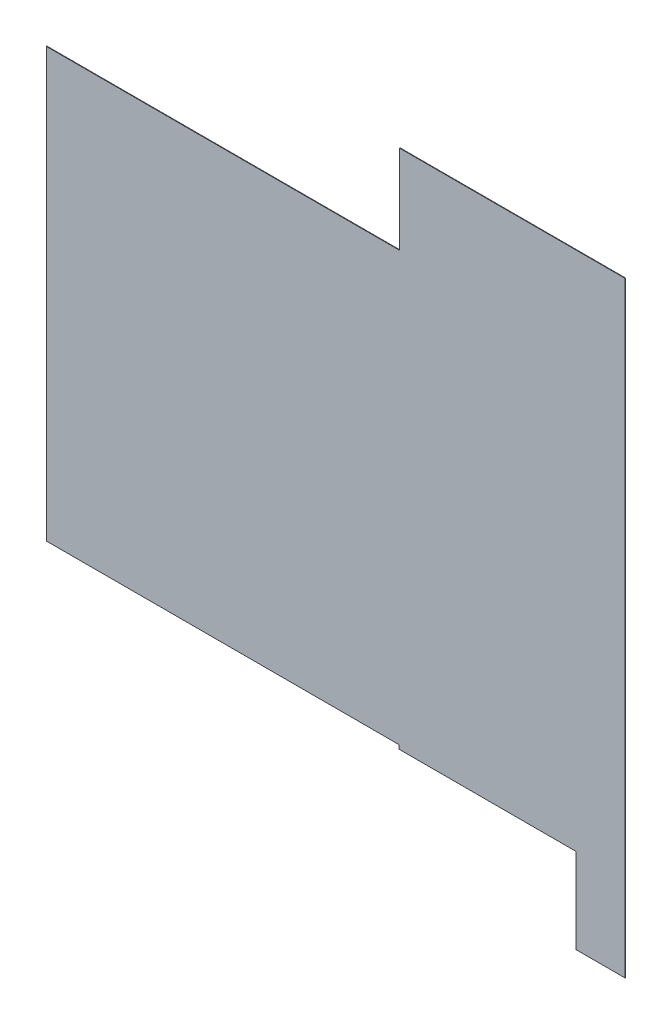
ISO-10303-21;
HEADER;
FILE_DESCRIPTION(('STEP AP214'),'2;1');
FILE_NAME('part.step','',(''),(''),'','','');
FILE_SCHEMA(('AUTOMOTIVE_DESIGN { 1 0 10303 214 1 1 1 1 }'));
ENDSEC;
DATA;
#1=APPLICATION_CONTEXT('core data for automotive mechanical design processes');
#2=APPLICATION_PROTOCOL_DEFINITION('international standard','automotive_design',2000,#1);
#3=PRODUCT_CONTEXT('',#1,'mechanical');
#4=PRODUCT('Part','Part','',(#3));
#5=PRODUCT_RELATED_PRODUCT_CATEGORY('part','',(#4));
#6=PRODUCT_DEFINITION_FORMATION('','',#4);
#7=PRODUCT_DEFINITION_CONTEXT('part definition',#1,'design');
#8=PRODUCT_DEFINITION('design','',#6,#7);
#9=PRODUCT_DEFINITION_SHAPE('','',#8);
#10=(LENGTH_UNIT() NAMED_UNIT(*) SI_UNIT(.MILLI.,.METRE.));
#11=(NAMED_UNIT(*) PLANE_ANGLE_UNIT() SI_UNIT($,.RADIAN.));
#12=(NAMED_UNIT(*) SI_UNIT($,.STERADIAN.) SOLID_ANGLE_UNIT());
#13=UNCERTAINTY_MEASURE_WITH_UNIT(LENGTH_MEASURE(1.E-05),#10,'distance_accuracy_value','');
#14=(GEOMETRIC_REPRESENTATION_CONTEXT(3) GLOBAL_UNCERTAINTY_ASSIGNED_CONTEXT((#13)) GLOBAL_UNIT_ASSIGNED_CONTEXT((#10,
#11,#12)) REPRESENTATION_CONTEXT('',''));
#15=CARTESIAN_POINT('',(0.,0.,0.));
#16=DIRECTION('',(0.,0.,1.));
#17=DIRECTION('',(1.,0.,0.));
#18=AXIS2_PLACEMENT_3D('',#15,#16,#17);
#19=CARTESIAN_POINT('',(2035.,1817.,2.));
#20=DIRECTION('',(0.,-1.,0.));
#21=DIRECTION('',(0.,0.,-1.));
#22=AXIS2_PLACEMENT_3D('',#19,#20,#21);
#23=PLANE('',#22);
#24=DIRECTION('',(-1.,0.,0.));
#25=VECTOR('',#24,1.);
#26=CARTESIAN_POINT('',(2035.,1817.,0.));
#27=LINE('',#26,#25);
#28=CARTESIAN_POINT('',(2035.,1817.,0.));
#29=VERTEX_POINT('',#28);
#30=CARTESIAN_POINT('',(1242.,1817.,0.));
#31=VERTEX_POINT('',#30);
#32=EDGE_CURVE('E146',#29,#31,#27,.T.);
#33=ORIENTED_EDGE('',*,*,#32,.T.);
#34=DIRECTION('',(0.,0.,-1.));
#35=VECTOR('',#34,1.);
#36=CARTESIAN_POINT('',(1242.,1817.,2.));
#37=LINE('',#36,#35);
#38=CARTESIAN_POINT('',(1242.,1817.,2.));
#39=VERTEX_POINT('',#38);
#40=EDGE_CURVE('E41',#39,#31,#37,.T.);
#41=ORIENTED_EDGE('',*,*,#40,.F.);
#42=DIRECTION('',(-1.,0.,0.));
#43=VECTOR('',#42,1.);
#44=CARTESIAN_POINT('',(2035.,1817.,2.));
#45=LINE('',#44,#43);
#46=CARTESIAN_POINT('',(2035.,1817.,2.));
#47=VERTEX_POINT('',#46);
#48=EDGE_CURVE('E163',#47,#39,#45,.T.);
#49=ORIENTED_EDGE('',*,*,#48,.F.);
#50=DIRECTION('',(0.,0.,-1.));
#51=VECTOR('',#50,1.);
#52=CARTESIAN_POINT('',(2035.,1817.,2.));
#53=LINE('',#52,#51);
#54=EDGE_CURVE('E145',#47,#29,#53,.T.);
#55=ORIENTED_EDGE('',*,*,#54,.T.);
#56=EDGE_LOOP('',(#33,#41,#49,#55));
#57=FACE_BOUND('',#56,.T.);
#58=ADVANCED_FACE('F33',(#57),#23,.F.);
#59=CARTESIAN_POINT('',(1242.,1817.,2.));
#60=DIRECTION('',(1.,0.,0.));
#61=DIRECTION('',(0.,1.,0.));
#62=AXIS2_PLACEMENT_3D('',#59,#60,#61);
#63=PLANE('',#62);
#64=DIRECTION('',(0.,-1.,0.));
#65=VECTOR('',#64,1.);
#66=CARTESIAN_POINT('',(1242.,1817.,0.));
#67=LINE('',#66,#65);
#68=CARTESIAN_POINT('',(1242.,1506.,0.));
#69=VERTEX_POINT('',#68);
#70=EDGE_CURVE('E149',#31,#69,#67,.T.);
#71=ORIENTED_EDGE('',*,*,#70,.T.);
#72=DIRECTION('',(0.,0.,-1.));
#73=VECTOR('',#72,1.);
#74=CARTESIAN_POINT('',(1242.,1506.,2.));
#75=LINE('',#74,#73);
#76=CARTESIAN_POINT('',(1242.,1506.,2.));
#77=VERTEX_POINT('',#76);
#78=EDGE_CURVE('E173',#77,#69,#75,.T.);
#79=ORIENTED_EDGE('',*,*,#78,.F.);
#80=DIRECTION('',(0.,-1.,0.));
#81=VECTOR('',#80,1.);
#82=CARTESIAN_POINT('',(1242.,1817.,2.));
#83=LINE('',#82,#81);
#84=EDGE_CURVE('E94',#39,#77,#83,.T.);
#85=ORIENTED_EDGE('',*,*,#84,.F.);
#86=ORIENTED_EDGE('',*,*,#40,.T.);
#87=EDGE_LOOP('',(#71,#79,#85,#86));
#88=FACE_BOUND('',#87,.T.);
#89=ADVANCED_FACE('F176',(#88),#63,.F.);
#90=CARTESIAN_POINT('',(1242.,1506.,2.));
#91=DIRECTION('',(0.,-1.,0.));
#92=DIRECTION('',(1.,0.,0.));
#93=AXIS2_PLACEMENT_3D('',#90,#91,#92);
#94=PLANE('',#93);
#95=DIRECTION('',(-1.,0.,0.));
#96=VECTOR('',#95,1.);
#97=CARTESIAN_POINT('',(1242.,1506.,0.));
#98=LINE('',#97,#96);
#99=CARTESIAN_POINT('',(0.,1506.,0.));
#100=VERTEX_POINT('',#99);
#101=EDGE_CURVE('E152',#69,#100,#98,.T.);
#102=ORIENTED_EDGE('',*,*,#101,.T.);
#103=DIRECTION('',(0.,0.,-1.));
#104=VECTOR('',#103,1.);
#105=CARTESIAN_POINT('',(0.,1506.,2.));
#106=LINE('',#105,#104);
#107=CARTESIAN_POINT('',(0.,1506.,2.));
#108=VERTEX_POINT('',#107);
#109=EDGE_CURVE('E170',#108,#100,#106,.T.);
#110=ORIENTED_EDGE('',*,*,#109,.F.);
#111=DIRECTION('',(-1.,0.,0.));
#112=VECTOR('',#111,1.);
#113=CARTESIAN_POINT('',(1242.,1506.,2.));
#114=LINE('',#113,#112);
#115=EDGE_CURVE('E194',#77,#108,#114,.T.);
#116=ORIENTED_EDGE('',*,*,#115,.F.);
#117=ORIENTED_EDGE('',*,*,#78,.T.);
#118=EDGE_LOOP('',(#102,#110,#116,#117));
#119=FACE_BOUND('',#118,.T.);
#120=ADVANCED_FACE('F187',(#119),#94,.F.);
#121=CARTESIAN_POINT('',(0.,1506.,2.));
#122=DIRECTION('',(1.,0.,0.));
#123=DIRECTION('',(0.,1.,0.));
#124=AXIS2_PLACEMENT_3D('',#121,#122,#123);
#125=PLANE('',#124);
#126=DIRECTION('',(0.,-1.,0.));
#127=VECTOR('',#126,1.);
#128=CARTESIAN_POINT('',(0.,1506.,0.));
#129=LINE('',#128,#127);
#130=CARTESIAN_POINT('',(0.,0.,0.));
#131=VERTEX_POINT('',#130);
#132=EDGE_CURVE('E154',#100,#131,#129,.T.);
#133=ORIENTED_EDGE('',*,*,#132,.T.);
#134=DIRECTION('',(0.,0.,-1.));
#135=VECTOR('',#134,1.);
#136=CARTESIAN_POINT('',(0.,0.,2.));
#137=LINE('',#136,#135);
#138=CARTESIAN_POINT('',(0.,0.,2.));
#139=VERTEX_POINT('',#138);
#140=EDGE_CURVE('E167',#139,#131,#137,.T.);
#141=ORIENTED_EDGE('',*,*,#140,.F.);
#142=DIRECTION('',(0.,-1.,0.));
#143=VECTOR('',#142,1.);
#144=CARTESIAN_POINT('',(0.,1506.,2.));
#145=LINE('',#144,#143);
#146=EDGE_CURVE('E193',#108,#139,#145,.T.);
#147=ORIENTED_EDGE('',*,*,#146,.F.);
#148=ORIENTED_EDGE('',*,*,#109,.T.);
#149=EDGE_LOOP('',(#133,#141,#147,#148));
#150=FACE_BOUND('',#149,.T.);
#151=ADVANCED_FACE('F191',(#150),#125,.F.);
#152=CARTESIAN_POINT('',(1239.99881305592,0.,2.));
#153=DIRECTION('',(0.,1.,0.));
#154=DIRECTION('',(-1.,0.,0.));
#155=AXIS2_PLACEMENT_3D('',#152,#153,#154);
#156=PLANE('',#155);
#157=DIRECTION('',(1.,0.,0.));
#158=VECTOR('',#157,1.);
#159=CARTESIAN_POINT('',(1239.99881305592,0.,0.));
#160=LINE('',#159,#158);
#161=CARTESIAN_POINT('',(1239.99881305592,0.,0.));
#162=VERTEX_POINT('',#161);
#163=EDGE_CURVE('E156',#131,#162,#160,.T.);
#164=ORIENTED_EDGE('',*,*,#163,.T.);
#165=DIRECTION('',(0.,0.,-1.));
#166=VECTOR('',#165,1.);
#167=CARTESIAN_POINT('',(1239.99881305592,0.,2.));
#168=LINE('',#167,#166);
#169=CARTESIAN_POINT('',(1239.99881305592,0.,2.));
#170=VERTEX_POINT('',#169);
#171=EDGE_CURVE('E132',#170,#162,#168,.T.);
#172=ORIENTED_EDGE('',*,*,#171,.F.);
#173=DIRECTION('',(1.,0.,0.));
#174=VECTOR('',#173,1.);
#175=CARTESIAN_POINT('',(1239.99881305592,0.,2.));
#176=LINE('',#175,#174);
#177=EDGE_CURVE('E119',#139,#170,#176,.T.);
#178=ORIENTED_EDGE('',*,*,#177,.F.);
#179=ORIENTED_EDGE('',*,*,#140,.T.);
#180=EDGE_LOOP('',(#164,#172,#178,#179));
#181=FACE_BOUND('',#180,.T.);
#182=ADVANCED_FACE('F236',(#181),#156,.F.);
#183=CARTESIAN_POINT('',(1239.99881305592,0.,2.));
#184=DIRECTION('',(1.,0.,0.));
#185=DIRECTION('',(0.,0.,-1.));
#186=AXIS2_PLACEMENT_3D('',#183,#184,#185);
#187=PLANE('',#186);
#188=DIRECTION('',(0.,-1.,0.));
#189=VECTOR('',#188,1.);
#190=CARTESIAN_POINT('',(1239.99881305592,0.,0.));
#191=LINE('',#190,#189);
#192=CARTESIAN_POINT('',(1239.99881305592,-14.,0.));
#193=VERTEX_POINT('',#192);
#194=EDGE_CURVE('E128',#162,#193,#191,.T.);
#195=ORIENTED_EDGE('',*,*,#194,.T.);
#196=DIRECTION('',(0.,0.,-1.));
#197=VECTOR('',#196,1.);
#198=CARTESIAN_POINT('',(1239.99881305592,-14.,2.));
#199=LINE('',#198,#197);
#200=CARTESIAN_POINT('',(1239.99881305592,-14.,2.));
#201=VERTEX_POINT('',#200);
#202=EDGE_CURVE('E125',#201,#193,#199,.T.);
#203=ORIENTED_EDGE('',*,*,#202,.F.);
#204=DIRECTION('',(0.,-1.,0.));
#205=VECTOR('',#204,1.);
#206=CARTESIAN_POINT('',(1239.99881305592,0.,2.));
#207=LINE('',#206,#205);
#208=EDGE_CURVE('E110',#170,#201,#207,.T.);
#209=ORIENTED_EDGE('',*,*,#208,.F.);
#210=ORIENTED_EDGE('',*,*,#171,.T.);
#211=EDGE_LOOP('',(#195,#203,#209,#210));
#212=FACE_BOUND('',#211,.T.);
#213=ADVANCED_FACE('F126',(#212),#187,.F.);
#214=CARTESIAN_POINT('',(1672.99881305592,-13.9999999999999,2.));
#215=DIRECTION('',(0.,1.,0.));
#216=DIRECTION('',(-1.,0.,0.));
#217=AXIS2_PLACEMENT_3D('',#214,#215,#216);
#218=PLANE('',#217);
#219=DIRECTION('',(1.,0.,0.));
#220=VECTOR('',#219,1.);
#221=CARTESIAN_POINT('',(1672.99881305592,-13.9999999999999,0.));
#222=LINE('',#221,#220);
#223=CARTESIAN_POINT('',(1863.,-13.9999999999931,0.));
#224=VERTEX_POINT('',#223);
#225=EDGE_CURVE('E159',#193,#224,#222,.T.);
#226=ORIENTED_EDGE('',*,*,#225,.T.);
#227=DIRECTION('',(0.,0.,1.));
#228=VECTOR('',#227,1.);
#229=CARTESIAN_POINT('',(1863.,-13.9999999999931,87.0000000000106));
#230=LINE('',#229,#228);
#231=CARTESIAN_POINT('',(1863.,-13.9999999999931,2.00000000000003));
#232=VERTEX_POINT('',#231);
#233=EDGE_CURVE('E138',#224,#232,#230,.T.);
#234=ORIENTED_EDGE('',*,*,#233,.T.);
#235=DIRECTION('',(1.,0.,0.));
#236=VECTOR('',#235,1.);
#237=CARTESIAN_POINT('',(1672.99881305592,-13.9999999999999,2.));
#238=LINE('',#237,#236);
#239=EDGE_CURVE('E116',#201,#232,#238,.T.);
#240=ORIENTED_EDGE('',*,*,#239,.F.);
#241=ORIENTED_EDGE('',*,*,#202,.T.);
#242=EDGE_LOOP('',(#226,#234,#240,#241));
#243=FACE_BOUND('',#242,.T.);
#244=ADVANCED_FACE('F136',(#243),#218,.F.);
#245=CARTESIAN_POINT('',(1672.99881305592,-313.,2.));
#246=DIRECTION('',(0.,1.,0.));
#247=DIRECTION('',(0.,0.,1.));
#248=AXIS2_PLACEMENT_3D('',#245,#246,#247);
#249=PLANE('',#248);
#250=DIRECTION('',(1.,0.,0.));
#251=VECTOR('',#250,1.);
#252=CARTESIAN_POINT('',(1672.99881305592,-313.,2.));
#253=LINE('',#252,#251);
#254=CARTESIAN_POINT('',(1863.,-313.,2.));
#255=VERTEX_POINT('',#254);
#256=CARTESIAN_POINT('',(2035.,-313.,2.));
#257=VERTEX_POINT('',#256);
#258=EDGE_CURVE('E139',#255,#257,#253,.T.);
#259=ORIENTED_EDGE('',*,*,#258,.F.);
#260=DIRECTION('',(0.,0.,-1.));
#261=VECTOR('',#260,1.);
#262=CARTESIAN_POINT('',(1863.,-313.,2.00000000000008));
#263=LINE('',#262,#261);
#264=CARTESIAN_POINT('',(1863.,-313.,0.));
#265=VERTEX_POINT('',#264);
#266=EDGE_CURVE('E201',#255,#265,#263,.T.);
#267=ORIENTED_EDGE('',*,*,#266,.T.);
#268=DIRECTION('',(1.,0.,0.));
#269=VECTOR('',#268,1.);
#270=CARTESIAN_POINT('',(1672.99881305592,-313.,0.));
#271=LINE('',#270,#269);
#272=CARTESIAN_POINT('',(2035.,-313.,0.));
#273=VERTEX_POINT('',#272);
#274=EDGE_CURVE('E79',#265,#273,#271,.T.);
#275=ORIENTED_EDGE('',*,*,#274,.T.);
#276=DIRECTION('',(0.,0.,-1.));
#277=VECTOR('',#276,1.);
#278=CARTESIAN_POINT('',(2035.,-313.,2.));
#279=LINE('',#278,#277);
#280=EDGE_CURVE('E133',#257,#273,#279,.T.);
#281=ORIENTED_EDGE('',*,*,#280,.F.);
#282=EDGE_LOOP('',(#259,#267,#275,#281));
#283=FACE_BOUND('',#282,.T.);
#284=ADVANCED_FACE('F206',(#283),#249,.F.);
#285=CARTESIAN_POINT('',(2035.,-313.,2.));
#286=DIRECTION('',(-1.,0.,0.));
#287=DIRECTION('',(0.,0.,1.));
#288=AXIS2_PLACEMENT_3D('',#285,#286,#287);
#289=PLANE('',#288);
#290=DIRECTION('',(0.,1.,0.));
#291=VECTOR('',#290,1.);
#292=CARTESIAN_POINT('',(2035.,-313.,0.));
#293=LINE('',#292,#291);
#294=EDGE_CURVE('E85',#273,#29,#293,.T.);
#295=ORIENTED_EDGE('',*,*,#294,.T.);
#296=ORIENTED_EDGE('',*,*,#54,.F.);
#297=DIRECTION('',(0.,1.,0.));
#298=VECTOR('',#297,1.);
#299=CARTESIAN_POINT('',(2035.,-313.,2.));
#300=LINE('',#299,#298);
#301=EDGE_CURVE('E49',#257,#47,#300,.T.);
#302=ORIENTED_EDGE('',*,*,#301,.F.);
#303=ORIENTED_EDGE('',*,*,#280,.T.);
#304=EDGE_LOOP('',(#295,#296,#302,#303));
#305=FACE_BOUND('',#304,.T.);
#306=ADVANCED_FACE('F213',(#305),#289,.F.);
#307=CARTESIAN_POINT('',(0.,0.,2.));
#308=DIRECTION('',(0.,0.,1.));
#309=DIRECTION('',(1.,0.,0.));
#310=AXIS2_PLACEMENT_3D('',#307,#308,#309);
#311=PLANE('',#310);
#312=DIRECTION('',(0.,1.,0.));
#313=VECTOR('',#312,1.);
#314=CARTESIAN_POINT('',(1863.,0.,2.));
#315=LINE('',#314,#313);
#316=EDGE_CURVE('E150',#255,#232,#315,.T.);
#317=ORIENTED_EDGE('',*,*,#316,.F.);
#318=ORIENTED_EDGE('',*,*,#258,.T.);
#319=ORIENTED_EDGE('',*,*,#301,.T.);
#320=ORIENTED_EDGE('',*,*,#48,.T.);
#321=ORIENTED_EDGE('',*,*,#84,.T.);
#322=ORIENTED_EDGE('',*,*,#115,.T.);
#323=ORIENTED_EDGE('',*,*,#146,.T.);
#324=ORIENTED_EDGE('',*,*,#177,.T.);
#325=ORIENTED_EDGE('',*,*,#208,.T.);
#326=ORIENTED_EDGE('',*,*,#239,.T.);
#327=EDGE_LOOP('',(#317,#318,#319,#320,#321,#322,#323,#324,#325,#326));
#328=FACE_BOUND('',#327,.T.);
#329=ADVANCED_FACE('F113',(#328),#311,.T.);
#330=CARTESIAN_POINT('',(0.,0.,0.));
#331=DIRECTION('',(0.,0.,1.));
#332=DIRECTION('',(1.,0.,0.));
#333=AXIS2_PLACEMENT_3D('',#330,#331,#332);
#334=PLANE('',#333);
#335=ORIENTED_EDGE('',*,*,#274,.F.);
#336=DIRECTION('',(0.,1.,0.));
#337=VECTOR('',#336,1.);
#338=CARTESIAN_POINT('',(1863.,0.,0.));
#339=LINE('',#338,#337);
#340=EDGE_CURVE('E11',#265,#224,#339,.T.);
#341=ORIENTED_EDGE('',*,*,#340,.T.);
#342=ORIENTED_EDGE('',*,*,#225,.F.);
#343=ORIENTED_EDGE('',*,*,#194,.F.);
#344=ORIENTED_EDGE('',*,*,#163,.F.);
#345=ORIENTED_EDGE('',*,*,#132,.F.);
#346=ORIENTED_EDGE('',*,*,#101,.F.);
#347=ORIENTED_EDGE('',*,*,#70,.F.);
#348=ORIENTED_EDGE('',*,*,#32,.F.);
#349=ORIENTED_EDGE('',*,*,#294,.F.);
#350=EDGE_LOOP('',(#335,#341,#342,#343,#344,#345,#346,#347,#348,#349));
#351=FACE_BOUND('',#350,.T.);
#352=ADVANCED_FACE('F181',(#351),#334,.F.);
#353=CARTESIAN_POINT('',(1863.,-13.9999999999931,87.0000000000106));
#354=DIRECTION('',(1.,0.,0.));
#355=DIRECTION('',(0.,0.,-1.));
#356=AXIS2_PLACEMENT_3D('',#353,#354,#355);
#357=PLANE('',#356);
#358=ORIENTED_EDGE('',*,*,#316,.T.);
#359=ORIENTED_EDGE('',*,*,#233,.F.);
#360=ORIENTED_EDGE('',*,*,#340,.F.);
#361=ORIENTED_EDGE('',*,*,#266,.F.);
#362=EDGE_LOOP('',(#358,#359,#360,#361));
#363=FACE_BOUND('',#362,.T.);
#364=ADVANCED_FACE('F211',(#363),#357,.F.);
#365=CLOSED_SHELL('',(#58,#89,#120,#151,#182,#213,#244,#284,#306,#329,#352,#364));
#366=MANIFOLD_SOLID_BREP('B2',#365);
#367=ADVANCED_BREP_SHAPE_REPRESENTATION('',(#18,#366),#14);
#368=SHAPE_DEFINITION_REPRESENTATION(#9,#367);
ENDSEC;
END-ISO-10303-21;
